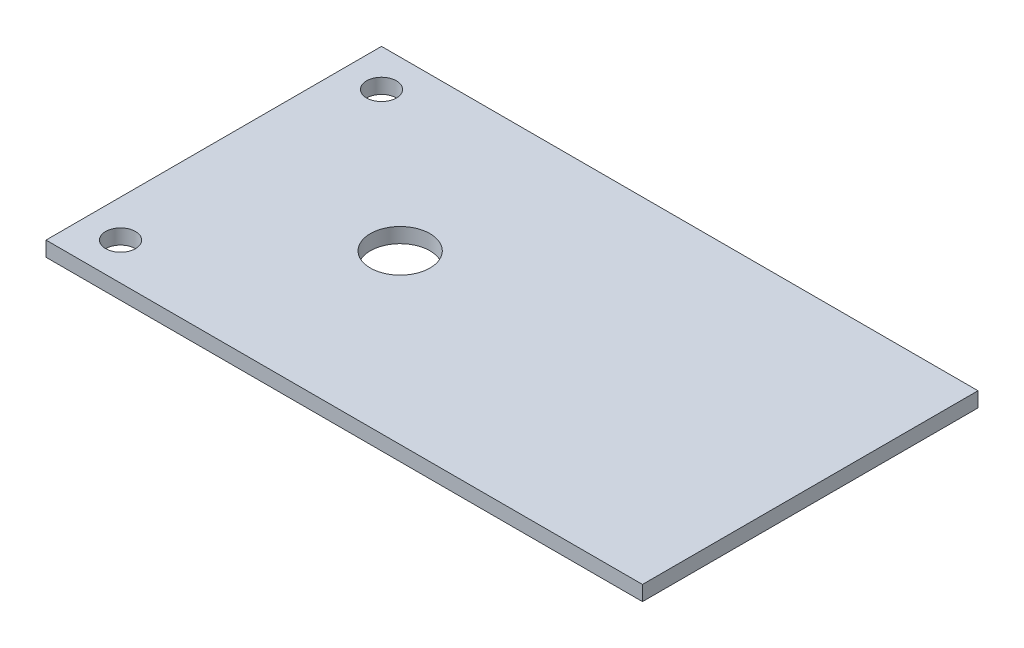
ISO-10303-21;
HEADER;
FILE_DESCRIPTION(('STEP AP214'),'2;1');
FILE_NAME('part.step','',(''),(''),'','','');
FILE_SCHEMA(('AUTOMOTIVE_DESIGN { 1 0 10303 214 1 1 1 1 }'));
ENDSEC;
DATA;
#1=APPLICATION_CONTEXT('core data for automotive mechanical design processes');
#2=APPLICATION_PROTOCOL_DEFINITION('international standard','automotive_design',2000,#1);
#3=PRODUCT_CONTEXT('',#1,'mechanical');
#4=PRODUCT('Part','Part','',(#3));
#5=PRODUCT_RELATED_PRODUCT_CATEGORY('part','',(#4));
#6=PRODUCT_DEFINITION_FORMATION('','',#4);
#7=PRODUCT_DEFINITION_CONTEXT('part definition',#1,'design');
#8=PRODUCT_DEFINITION('design','',#6,#7);
#9=PRODUCT_DEFINITION_SHAPE('','',#8);
#10=(LENGTH_UNIT() NAMED_UNIT(*) SI_UNIT(.MILLI.,.METRE.));
#11=(NAMED_UNIT(*) PLANE_ANGLE_UNIT() SI_UNIT($,.RADIAN.));
#12=(NAMED_UNIT(*) SI_UNIT($,.STERADIAN.) SOLID_ANGLE_UNIT());
#13=UNCERTAINTY_MEASURE_WITH_UNIT(LENGTH_MEASURE(1.E-05),#10,'distance_accuracy_value','');
#14=(GEOMETRIC_REPRESENTATION_CONTEXT(3) GLOBAL_UNCERTAINTY_ASSIGNED_CONTEXT((#13)) GLOBAL_UNIT_ASSIGNED_CONTEXT((#10,
#11,#12)) REPRESENTATION_CONTEXT('',''));
#15=CARTESIAN_POINT('',(0.,0.,0.));
#16=DIRECTION('',(0.,0.,1.));
#17=DIRECTION('',(1.,0.,0.));
#18=AXIS2_PLACEMENT_3D('',#15,#16,#17);
#19=CARTESIAN_POINT('',(0.,4.,0.));
#20=DIRECTION('',(0.,-1.,0.));
#21=DIRECTION('',(0.,0.,-1.));
#22=AXIS2_PLACEMENT_3D('',#19,#20,#21);
#23=PLANE('',#22);
#24=CARTESIAN_POINT('',(10.,4.,-80.));
#25=DIRECTION('',(0.,1.,0.));
#26=DIRECTION('',(0.,0.,1.));
#27=AXIS2_PLACEMENT_3D('',#24,#25,#26);
#28=CIRCLE('',#27,4.);
#29=CARTESIAN_POINT('',(10.,4.,-76.));
#30=VERTEX_POINT('',#29);
#31=EDGE_CURVE('E115',#30,#30,#28,.T.);
#32=ORIENTED_EDGE('',*,*,#31,.F.);
#33=EDGE_LOOP('',(#32));
#34=FACE_BOUND('',#33,.T.);
#35=DIRECTION('',(0.,0.,1.));
#36=VECTOR('',#35,1.);
#37=CARTESIAN_POINT('',(0.,4.,0.));
#38=LINE('',#37,#36);
#39=CARTESIAN_POINT('',(0.,4.,-90.));
#40=VERTEX_POINT('',#39);
#41=CARTESIAN_POINT('',(0.,4.,0.));
#42=VERTEX_POINT('',#41);
#43=EDGE_CURVE('E85',#40,#42,#38,.T.);
#44=ORIENTED_EDGE('',*,*,#43,.T.);
#45=DIRECTION('',(1.,0.,0.));
#46=VECTOR('',#45,1.);
#47=CARTESIAN_POINT('',(0.,4.,0.));
#48=LINE('',#47,#46);
#49=CARTESIAN_POINT('',(160.,4.,0.));
#50=VERTEX_POINT('',#49);
#51=EDGE_CURVE('E80',#42,#50,#48,.T.);
#52=ORIENTED_EDGE('',*,*,#51,.T.);
#53=DIRECTION('',(0.,0.,-1.));
#54=VECTOR('',#53,1.);
#55=CARTESIAN_POINT('',(160.,4.,0.));
#56=LINE('',#55,#54);
#57=CARTESIAN_POINT('',(160.,4.,-90.));
#58=VERTEX_POINT('',#57);
#59=EDGE_CURVE('E83',#50,#58,#56,.T.);
#60=ORIENTED_EDGE('',*,*,#59,.T.);
#61=DIRECTION('',(-1.,0.,0.));
#62=VECTOR('',#61,1.);
#63=CARTESIAN_POINT('',(0.,4.,-90.));
#64=LINE('',#63,#62);
#65=EDGE_CURVE('E50',#58,#40,#64,.T.);
#66=ORIENTED_EDGE('',*,*,#65,.T.);
#67=EDGE_LOOP('',(#44,#52,#60,#66));
#68=FACE_BOUND('',#67,.T.);
#69=CARTESIAN_POINT('',(10.,4.,-10.));
#70=DIRECTION('',(0.,1.,0.));
#71=DIRECTION('',(0.,0.,1.));
#72=AXIS2_PLACEMENT_3D('',#69,#70,#71);
#73=CIRCLE('',#72,4.);
#74=CARTESIAN_POINT('',(10.,4.,-6.));
#75=VERTEX_POINT('',#74);
#76=EDGE_CURVE('E100',#75,#75,#73,.T.);
#77=ORIENTED_EDGE('',*,*,#76,.F.);
#78=EDGE_LOOP('',(#77));
#79=FACE_BOUND('',#78,.T.);
#80=CARTESIAN_POINT('',(50.,4.,-45.));
#81=DIRECTION('',(0.,1.,0.));
#82=DIRECTION('',(0.,0.,1.));
#83=AXIS2_PLACEMENT_3D('',#80,#81,#82);
#84=CIRCLE('',#83,8.);
#85=CARTESIAN_POINT('',(50.,4.,-37.));
#86=VERTEX_POINT('',#85);
#87=EDGE_CURVE('E121',#86,#86,#84,.T.);
#88=ORIENTED_EDGE('',*,*,#87,.F.);
#89=EDGE_LOOP('',(#88));
#90=FACE_BOUND('',#89,.T.);
#91=ADVANCED_FACE('F33',(#34,#68,#79,#90),#23,.F.);
#92=CARTESIAN_POINT('',(0.,0.,0.));
#93=DIRECTION('',(0.,-1.,0.));
#94=DIRECTION('',(0.,0.,-1.));
#95=AXIS2_PLACEMENT_3D('',#92,#93,#94);
#96=PLANE('',#95);
#97=CARTESIAN_POINT('',(10.,0.,-80.));
#98=DIRECTION('',(0.,1.,0.));
#99=DIRECTION('',(0.,0.,1.));
#100=AXIS2_PLACEMENT_3D('',#97,#98,#99);
#101=CIRCLE('',#100,4.);
#102=CARTESIAN_POINT('',(10.,0.,-76.));
#103=VERTEX_POINT('',#102);
#104=EDGE_CURVE('E118',#103,#103,#101,.T.);
#105=ORIENTED_EDGE('',*,*,#104,.T.);
#106=EDGE_LOOP('',(#105));
#107=FACE_BOUND('',#106,.T.);
#108=DIRECTION('',(0.,0.,1.));
#109=VECTOR('',#108,1.);
#110=CARTESIAN_POINT('',(0.,0.,0.));
#111=LINE('',#110,#109);
#112=CARTESIAN_POINT('',(0.,0.,-90.));
#113=VERTEX_POINT('',#112);
#114=CARTESIAN_POINT('',(0.,0.,0.));
#115=VERTEX_POINT('',#114);
#116=EDGE_CURVE('E97',#113,#115,#111,.T.);
#117=ORIENTED_EDGE('',*,*,#116,.F.);
#118=DIRECTION('',(-1.,0.,0.));
#119=VECTOR('',#118,1.);
#120=CARTESIAN_POINT('',(0.,0.,-90.));
#121=LINE('',#120,#119);
#122=CARTESIAN_POINT('',(160.,0.,-90.));
#123=VERTEX_POINT('',#122);
#124=EDGE_CURVE('E73',#123,#113,#121,.T.);
#125=ORIENTED_EDGE('',*,*,#124,.F.);
#126=DIRECTION('',(0.,0.,-1.));
#127=VECTOR('',#126,1.);
#128=CARTESIAN_POINT('',(160.,0.,0.));
#129=LINE('',#128,#127);
#130=CARTESIAN_POINT('',(160.,0.,0.));
#131=VERTEX_POINT('',#130);
#132=EDGE_CURVE('E67',#131,#123,#129,.T.);
#133=ORIENTED_EDGE('',*,*,#132,.F.);
#134=DIRECTION('',(1.,0.,0.));
#135=VECTOR('',#134,1.);
#136=CARTESIAN_POINT('',(0.,0.,0.));
#137=LINE('',#136,#135);
#138=EDGE_CURVE('E89',#115,#131,#137,.T.);
#139=ORIENTED_EDGE('',*,*,#138,.F.);
#140=EDGE_LOOP('',(#117,#125,#133,#139));
#141=FACE_BOUND('',#140,.T.);
#142=CARTESIAN_POINT('',(10.,0.,-10.));
#143=DIRECTION('',(0.,1.,0.));
#144=DIRECTION('',(0.,0.,1.));
#145=AXIS2_PLACEMENT_3D('',#142,#143,#144);
#146=CIRCLE('',#145,4.);
#147=CARTESIAN_POINT('',(10.,0.,-6.));
#148=VERTEX_POINT('',#147);
#149=EDGE_CURVE('E112',#148,#148,#146,.T.);
#150=ORIENTED_EDGE('',*,*,#149,.T.);
#151=EDGE_LOOP('',(#150));
#152=FACE_BOUND('',#151,.T.);
#153=CARTESIAN_POINT('',(50.,0.,-45.));
#154=DIRECTION('',(0.,1.,0.));
#155=DIRECTION('',(0.,0.,1.));
#156=AXIS2_PLACEMENT_3D('',#153,#154,#155);
#157=CIRCLE('',#156,8.);
#158=CARTESIAN_POINT('',(50.,0.,-37.));
#159=VERTEX_POINT('',#158);
#160=EDGE_CURVE('E124',#159,#159,#157,.T.);
#161=ORIENTED_EDGE('',*,*,#160,.T.);
#162=EDGE_LOOP('',(#161));
#163=FACE_BOUND('',#162,.T.);
#164=ADVANCED_FACE('F108',(#107,#141,#152,#163),#96,.T.);
#165=CARTESIAN_POINT('',(0.,4.,0.));
#166=DIRECTION('',(1.,0.,0.));
#167=DIRECTION('',(0.,0.,-1.));
#168=AXIS2_PLACEMENT_3D('',#165,#166,#167);
#169=PLANE('',#168);
#170=ORIENTED_EDGE('',*,*,#116,.T.);
#171=DIRECTION('',(0.,-1.,0.));
#172=VECTOR('',#171,1.);
#173=CARTESIAN_POINT('',(0.,4.,0.));
#174=LINE('',#173,#172);
#175=EDGE_CURVE('E11',#42,#115,#174,.T.);
#176=ORIENTED_EDGE('',*,*,#175,.F.);
#177=ORIENTED_EDGE('',*,*,#43,.F.);
#178=DIRECTION('',(0.,-1.,0.));
#179=VECTOR('',#178,1.);
#180=CARTESIAN_POINT('',(0.,4.,-90.));
#181=LINE('',#180,#179);
#182=EDGE_CURVE('E93',#40,#113,#181,.T.);
#183=ORIENTED_EDGE('',*,*,#182,.T.);
#184=EDGE_LOOP('',(#170,#176,#177,#183));
#185=FACE_BOUND('',#184,.T.);
#186=ADVANCED_FACE('F35',(#185),#169,.F.);
#187=CARTESIAN_POINT('',(0.,4.,0.));
#188=DIRECTION('',(0.,0.,-1.));
#189=DIRECTION('',(-1.,0.,0.));
#190=AXIS2_PLACEMENT_3D('',#187,#188,#189);
#191=PLANE('',#190);
#192=ORIENTED_EDGE('',*,*,#138,.T.);
#193=DIRECTION('',(0.,-1.,0.));
#194=VECTOR('',#193,1.);
#195=CARTESIAN_POINT('',(160.,4.,0.));
#196=LINE('',#195,#194);
#197=EDGE_CURVE('E42',#50,#131,#196,.T.);
#198=ORIENTED_EDGE('',*,*,#197,.F.);
#199=ORIENTED_EDGE('',*,*,#51,.F.);
#200=ORIENTED_EDGE('',*,*,#175,.T.);
#201=EDGE_LOOP('',(#192,#198,#199,#200));
#202=FACE_BOUND('',#201,.T.);
#203=ADVANCED_FACE('F88',(#202),#191,.F.);
#204=CARTESIAN_POINT('',(160.,4.,0.));
#205=DIRECTION('',(-1.,0.,0.));
#206=DIRECTION('',(0.,0.,1.));
#207=AXIS2_PLACEMENT_3D('',#204,#205,#206);
#208=PLANE('',#207);
#209=ORIENTED_EDGE('',*,*,#132,.T.);
#210=DIRECTION('',(0.,-1.,0.));
#211=VECTOR('',#210,1.);
#212=CARTESIAN_POINT('',(160.,4.,-90.));
#213=LINE('',#212,#211);
#214=EDGE_CURVE('E90',#58,#123,#213,.T.);
#215=ORIENTED_EDGE('',*,*,#214,.F.);
#216=ORIENTED_EDGE('',*,*,#59,.F.);
#217=ORIENTED_EDGE('',*,*,#197,.T.);
#218=EDGE_LOOP('',(#209,#215,#216,#217));
#219=FACE_BOUND('',#218,.T.);
#220=ADVANCED_FACE('F91',(#219),#208,.F.);
#221=CARTESIAN_POINT('',(0.,4.,-90.));
#222=DIRECTION('',(0.,0.,1.));
#223=DIRECTION('',(1.,0.,0.));
#224=AXIS2_PLACEMENT_3D('',#221,#222,#223);
#225=PLANE('',#224);
#226=ORIENTED_EDGE('',*,*,#124,.T.);
#227=ORIENTED_EDGE('',*,*,#182,.F.);
#228=ORIENTED_EDGE('',*,*,#65,.F.);
#229=ORIENTED_EDGE('',*,*,#214,.T.);
#230=EDGE_LOOP('',(#226,#227,#228,#229));
#231=FACE_BOUND('',#230,.T.);
#232=ADVANCED_FACE('F105',(#231),#225,.F.);
#233=CARTESIAN_POINT('',(10.,4.,-10.));
#234=DIRECTION('',(0.,-1.,0.));
#235=DIRECTION('',(0.,0.,-1.));
#236=AXIS2_PLACEMENT_3D('',#233,#234,#235);
#237=CYLINDRICAL_SURFACE('',#236,4.);
#238=ORIENTED_EDGE('',*,*,#76,.T.);
#239=EDGE_LOOP('',(#238));
#240=FACE_BOUND('',#239,.T.);
#241=ORIENTED_EDGE('',*,*,#149,.F.);
#242=EDGE_LOOP('',(#241));
#243=FACE_BOUND('',#242,.T.);
#244=ADVANCED_FACE('F143',(#240,#243),#237,.F.);
#245=CARTESIAN_POINT('',(10.,4.,-80.));
#246=DIRECTION('',(0.,-1.,0.));
#247=DIRECTION('',(0.,0.,-1.));
#248=AXIS2_PLACEMENT_3D('',#245,#246,#247);
#249=CYLINDRICAL_SURFACE('',#248,4.);
#250=ORIENTED_EDGE('',*,*,#31,.T.);
#251=EDGE_LOOP('',(#250));
#252=FACE_BOUND('',#251,.T.);
#253=ORIENTED_EDGE('',*,*,#104,.F.);
#254=EDGE_LOOP('',(#253));
#255=FACE_BOUND('',#254,.T.);
#256=ADVANCED_FACE('F189',(#252,#255),#249,.F.);
#257=CARTESIAN_POINT('',(50.,4.,-45.));
#258=DIRECTION('',(0.,-1.,0.));
#259=DIRECTION('',(0.,0.,-1.));
#260=AXIS2_PLACEMENT_3D('',#257,#258,#259);
#261=CYLINDRICAL_SURFACE('',#260,8.);
#262=ORIENTED_EDGE('',*,*,#87,.T.);
#263=EDGE_LOOP('',(#262));
#264=FACE_BOUND('',#263,.T.);
#265=ORIENTED_EDGE('',*,*,#160,.F.);
#266=EDGE_LOOP('',(#265));
#267=FACE_BOUND('',#266,.T.);
#268=ADVANCED_FACE('F130',(#264,#267),#261,.F.);
#269=CLOSED_SHELL('',(#91,#164,#186,#203,#220,#232,#244,#256,#268));
#270=MANIFOLD_SOLID_BREP('B2',#269);
#271=ADVANCED_BREP_SHAPE_REPRESENTATION('',(#18,#270),#14);
#272=SHAPE_DEFINITION_REPRESENTATION(#9,#271);
ENDSEC;
END-ISO-10303-21;
